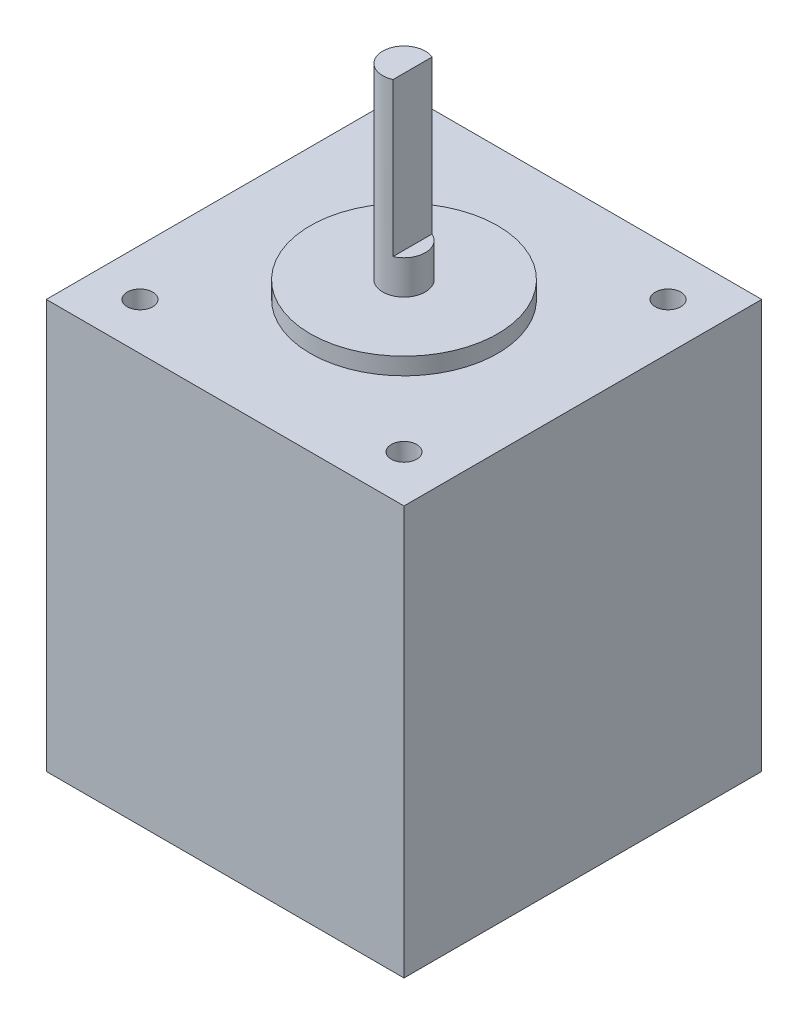
ISO-10303-21;
HEADER;
FILE_DESCRIPTION(('STEP AP214'),'2;1');
FILE_NAME('part.step','',(''),(''),'','','');
FILE_SCHEMA(('AUTOMOTIVE_DESIGN { 1 0 10303 214 1 1 1 1 }'));
ENDSEC;
DATA;
#1=APPLICATION_CONTEXT('core data for automotive mechanical design processes');
#2=APPLICATION_PROTOCOL_DEFINITION('international standard','automotive_design',2000,#1);
#3=PRODUCT_CONTEXT('',#1,'mechanical');
#4=PRODUCT('Part','Part','',(#3));
#5=PRODUCT_RELATED_PRODUCT_CATEGORY('part','',(#4));
#6=PRODUCT_DEFINITION_FORMATION('','',#4);
#7=PRODUCT_DEFINITION_CONTEXT('part definition',#1,'design');
#8=PRODUCT_DEFINITION('design','',#6,#7);
#9=PRODUCT_DEFINITION_SHAPE('','',#8);
#10=(LENGTH_UNIT() NAMED_UNIT(*) SI_UNIT(.MILLI.,.METRE.));
#11=(NAMED_UNIT(*) PLANE_ANGLE_UNIT() SI_UNIT($,.RADIAN.));
#12=(NAMED_UNIT(*) SI_UNIT($,.STERADIAN.) SOLID_ANGLE_UNIT());
#13=UNCERTAINTY_MEASURE_WITH_UNIT(LENGTH_MEASURE(1.E-05),#10,'distance_accuracy_value','');
#14=(GEOMETRIC_REPRESENTATION_CONTEXT(3) GLOBAL_UNCERTAINTY_ASSIGNED_CONTEXT((#13)) GLOBAL_UNIT_ASSIGNED_CONTEXT((#10,
#11,#12)) REPRESENTATION_CONTEXT('',''));
#15=CARTESIAN_POINT('',(0.,0.,0.));
#16=DIRECTION('',(0.,0.,1.));
#17=DIRECTION('',(1.,0.,0.));
#18=AXIS2_PLACEMENT_3D('',#15,#16,#17);
#19=CARTESIAN_POINT('',(21.,72.,-21.));
#20=DIRECTION('',(0.,-1.,0.));
#21=DIRECTION('',(0.,0.,-1.));
#22=AXIS2_PLACEMENT_3D('',#19,#20,#21);
#23=CYLINDRICAL_SURFACE('',#22,2.5);
#24=CARTESIAN_POINT('',(21.,50.,-21.));
#25=DIRECTION('',(0.,1.,0.));
#26=DIRECTION('',(0.,0.,1.));
#27=AXIS2_PLACEMENT_3D('',#24,#25,#26);
#28=CIRCLE('',#27,2.5);
#29=CARTESIAN_POINT('',(21.,50.,-18.5));
#30=VERTEX_POINT('',#29);
#31=EDGE_CURVE('E11',#30,#30,#28,.T.);
#32=ORIENTED_EDGE('',*,*,#31,.T.);
#33=EDGE_LOOP('',(#32));
#34=FACE_BOUND('',#33,.T.);
#35=DIRECTION('',(0.,1.,0.));
#36=VECTOR('',#35,1.);
#37=CARTESIAN_POINT('',(22.,54.,-18.7087121525221));
#38=LINE('',#37,#36);
#39=CARTESIAN_POINT('',(22.,54.,-18.7087121525221));
#40=VERTEX_POINT('',#39);
#41=CARTESIAN_POINT('',(22.,72.,-18.7087121525221));
#42=VERTEX_POINT('',#41);
#43=EDGE_CURVE('E105',#40,#42,#38,.T.);
#44=ORIENTED_EDGE('',*,*,#43,.T.);
#45=CARTESIAN_POINT('',(21.,72.,-21.));
#46=DIRECTION('',(0.,1.,0.));
#47=DIRECTION('',(0.,0.,1.));
#48=AXIS2_PLACEMENT_3D('',#45,#46,#47);
#49=CIRCLE('',#48,2.5);
#50=CARTESIAN_POINT('',(22.,72.,-23.2912878474779));
#51=VERTEX_POINT('',#50);
#52=EDGE_CURVE('E128',#51,#42,#49,.T.);
#53=ORIENTED_EDGE('',*,*,#52,.F.);
#54=DIRECTION('',(0.,1.,0.));
#55=VECTOR('',#54,1.);
#56=CARTESIAN_POINT('',(22.,54.,-23.2912878474779));
#57=LINE('',#56,#55);
#58=CARTESIAN_POINT('',(22.,54.,-23.2912878474779));
#59=VERTEX_POINT('',#58);
#60=EDGE_CURVE('E59',#59,#51,#57,.T.);
#61=ORIENTED_EDGE('',*,*,#60,.F.);
#62=CARTESIAN_POINT('',(21.,54.,-21.));
#63=DIRECTION('',(0.,1.,0.));
#64=DIRECTION('',(0.,0.,1.));
#65=AXIS2_PLACEMENT_3D('',#62,#63,#64);
#66=CIRCLE('',#65,2.5);
#67=EDGE_CURVE('E116',#40,#59,#66,.T.);
#68=ORIENTED_EDGE('',*,*,#67,.F.);
#69=EDGE_LOOP('',(#44,#53,#61,#68));
#70=FACE_BOUND('',#69,.T.);
#71=ADVANCED_FACE('F41',(#34,#70),#23,.T.);
#72=CARTESIAN_POINT('',(21.,72.,-21.));
#73=DIRECTION('',(0.,1.,0.));
#74=DIRECTION('',(0.,0.,1.));
#75=AXIS2_PLACEMENT_3D('',#72,#73,#74);
#76=PLANE('',#75);
#77=ORIENTED_EDGE('',*,*,#52,.T.);
#78=DIRECTION('',(0.,0.,-1.));
#79=VECTOR('',#78,1.);
#80=CARTESIAN_POINT('',(22.,72.,0.));
#81=LINE('',#80,#79);
#82=EDGE_CURVE('E110',#42,#51,#81,.T.);
#83=ORIENTED_EDGE('',*,*,#82,.T.);
#84=EDGE_LOOP('',(#77,#83));
#85=FACE_BOUND('',#84,.T.);
#86=ADVANCED_FACE('F230',(#85),#76,.T.);
#87=CARTESIAN_POINT('',(0.,48.,0.));
#88=DIRECTION('',(1.,0.,0.));
#89=DIRECTION('',(0.,0.,-1.));
#90=AXIS2_PLACEMENT_3D('',#87,#88,#89);
#91=PLANE('',#90);
#92=DIRECTION('',(0.,0.,1.));
#93=VECTOR('',#92,1.);
#94=CARTESIAN_POINT('',(0.,0.,0.));
#95=LINE('',#94,#93);
#96=CARTESIAN_POINT('',(0.,0.,-42.));
#97=VERTEX_POINT('',#96);
#98=CARTESIAN_POINT('',(0.,0.,0.));
#99=VERTEX_POINT('',#98);
#100=EDGE_CURVE('E168',#97,#99,#95,.T.);
#101=ORIENTED_EDGE('',*,*,#100,.T.);
#102=DIRECTION('',(0.,-1.,0.));
#103=VECTOR('',#102,1.);
#104=CARTESIAN_POINT('',(0.,48.,0.));
#105=LINE('',#104,#103);
#106=CARTESIAN_POINT('',(0.,48.,0.));
#107=VERTEX_POINT('',#106);
#108=EDGE_CURVE('E45',#107,#99,#105,.T.);
#109=ORIENTED_EDGE('',*,*,#108,.F.);
#110=DIRECTION('',(0.,0.,1.));
#111=VECTOR('',#110,1.);
#112=CARTESIAN_POINT('',(0.,48.,0.));
#113=LINE('',#112,#111);
#114=CARTESIAN_POINT('',(0.,48.,-42.));
#115=VERTEX_POINT('',#114);
#116=EDGE_CURVE('E172',#115,#107,#113,.T.);
#117=ORIENTED_EDGE('',*,*,#116,.F.);
#118=DIRECTION('',(0.,-1.,0.));
#119=VECTOR('',#118,1.);
#120=CARTESIAN_POINT('',(0.,48.,-42.));
#121=LINE('',#120,#119);
#122=EDGE_CURVE('E182',#115,#97,#121,.T.);
#123=ORIENTED_EDGE('',*,*,#122,.T.);
#124=EDGE_LOOP('',(#101,#109,#117,#123));
#125=FACE_BOUND('',#124,.T.);
#126=ADVANCED_FACE('F43',(#125),#91,.F.);
#127=CARTESIAN_POINT('',(0.,48.,0.));
#128=DIRECTION('',(0.,0.,-1.));
#129=DIRECTION('',(-1.,0.,0.));
#130=AXIS2_PLACEMENT_3D('',#127,#128,#129);
#131=PLANE('',#130);
#132=DIRECTION('',(1.,0.,0.));
#133=VECTOR('',#132,1.);
#134=CARTESIAN_POINT('',(0.,0.,0.));
#135=LINE('',#134,#133);
#136=CARTESIAN_POINT('',(42.,0.,0.));
#137=VERTEX_POINT('',#136);
#138=EDGE_CURVE('E186',#99,#137,#135,.T.);
#139=ORIENTED_EDGE('',*,*,#138,.T.);
#140=DIRECTION('',(0.,-1.,0.));
#141=VECTOR('',#140,1.);
#142=CARTESIAN_POINT('',(42.,48.,0.));
#143=LINE('',#142,#141);
#144=CARTESIAN_POINT('',(42.,48.,0.));
#145=VERTEX_POINT('',#144);
#146=EDGE_CURVE('E198',#145,#137,#143,.T.);
#147=ORIENTED_EDGE('',*,*,#146,.F.);
#148=DIRECTION('',(1.,0.,0.));
#149=VECTOR('',#148,1.);
#150=CARTESIAN_POINT('',(0.,48.,0.));
#151=LINE('',#150,#149);
#152=EDGE_CURVE('E97',#107,#145,#151,.T.);
#153=ORIENTED_EDGE('',*,*,#152,.F.);
#154=ORIENTED_EDGE('',*,*,#108,.T.);
#155=EDGE_LOOP('',(#139,#147,#153,#154));
#156=FACE_BOUND('',#155,.T.);
#157=ADVANCED_FACE('F206',(#156),#131,.F.);
#158=CARTESIAN_POINT('',(42.,48.,0.));
#159=DIRECTION('',(-1.,0.,0.));
#160=DIRECTION('',(0.,0.,1.));
#161=AXIS2_PLACEMENT_3D('',#158,#159,#160);
#162=PLANE('',#161);
#163=DIRECTION('',(0.,0.,-1.));
#164=VECTOR('',#163,1.);
#165=CARTESIAN_POINT('',(42.,0.,0.));
#166=LINE('',#165,#164);
#167=CARTESIAN_POINT('',(42.,0.,-42.));
#168=VERTEX_POINT('',#167);
#169=EDGE_CURVE('E189',#137,#168,#166,.T.);
#170=ORIENTED_EDGE('',*,*,#169,.T.);
#171=DIRECTION('',(0.,-1.,0.));
#172=VECTOR('',#171,1.);
#173=CARTESIAN_POINT('',(42.,48.,-42.));
#174=LINE('',#173,#172);
#175=CARTESIAN_POINT('',(42.,48.,-42.));
#176=VERTEX_POINT('',#175);
#177=EDGE_CURVE('E196',#176,#168,#174,.T.);
#178=ORIENTED_EDGE('',*,*,#177,.F.);
#179=DIRECTION('',(0.,0.,-1.));
#180=VECTOR('',#179,1.);
#181=CARTESIAN_POINT('',(42.,48.,0.));
#182=LINE('',#181,#180);
#183=EDGE_CURVE('E177',#145,#176,#182,.T.);
#184=ORIENTED_EDGE('',*,*,#183,.F.);
#185=ORIENTED_EDGE('',*,*,#146,.T.);
#186=EDGE_LOOP('',(#170,#178,#184,#185));
#187=FACE_BOUND('',#186,.T.);
#188=ADVANCED_FACE('F213',(#187),#162,.F.);
#189=CARTESIAN_POINT('',(0.,48.,-42.));
#190=DIRECTION('',(0.,0.,1.));
#191=DIRECTION('',(1.,0.,0.));
#192=AXIS2_PLACEMENT_3D('',#189,#190,#191);
#193=PLANE('',#192);
#194=DIRECTION('',(-1.,0.,0.));
#195=VECTOR('',#194,1.);
#196=CARTESIAN_POINT('',(0.,0.,-42.));
#197=LINE('',#196,#195);
#198=EDGE_CURVE('E89',#168,#97,#197,.T.);
#199=ORIENTED_EDGE('',*,*,#198,.T.);
#200=ORIENTED_EDGE('',*,*,#122,.F.);
#201=DIRECTION('',(-1.,0.,0.));
#202=VECTOR('',#201,1.);
#203=CARTESIAN_POINT('',(0.,48.,-42.));
#204=LINE('',#203,#202);
#205=EDGE_CURVE('E68',#176,#115,#204,.T.);
#206=ORIENTED_EDGE('',*,*,#205,.F.);
#207=ORIENTED_EDGE('',*,*,#177,.T.);
#208=EDGE_LOOP('',(#199,#200,#206,#207));
#209=FACE_BOUND('',#208,.T.);
#210=ADVANCED_FACE('F214',(#209),#193,.F.);
#211=CARTESIAN_POINT('',(0.,48.,0.));
#212=DIRECTION('',(0.,-1.,0.));
#213=DIRECTION('',(0.,0.,-1.));
#214=AXIS2_PLACEMENT_3D('',#211,#212,#213);
#215=PLANE('',#214);
#216=CARTESIAN_POINT('',(36.5,48.,-36.5));
#217=DIRECTION('',(0.,-1.,0.));
#218=DIRECTION('',(0.,0.,-1.));
#219=AXIS2_PLACEMENT_3D('',#216,#217,#218);
#220=CIRCLE('',#219,1.5);
#221=CARTESIAN_POINT('',(36.5,48.,-38.));
#222=VERTEX_POINT('',#221);
#223=EDGE_CURVE('E160',#222,#222,#220,.T.);
#224=ORIENTED_EDGE('',*,*,#223,.T.);
#225=EDGE_LOOP('',(#224));
#226=FACE_BOUND('',#225,.T.);
#227=CARTESIAN_POINT('',(36.5,48.,-5.50000000000001));
#228=DIRECTION('',(0.,-1.,0.));
#229=DIRECTION('',(0.,0.,-1.));
#230=AXIS2_PLACEMENT_3D('',#227,#228,#229);
#231=CIRCLE('',#230,1.5);
#232=CARTESIAN_POINT('',(36.5,48.,-7.00000000000001));
#233=VERTEX_POINT('',#232);
#234=EDGE_CURVE('E156',#233,#233,#231,.T.);
#235=ORIENTED_EDGE('',*,*,#234,.T.);
#236=EDGE_LOOP('',(#235));
#237=FACE_BOUND('',#236,.T.);
#238=CARTESIAN_POINT('',(5.50000000000001,48.,-5.50000000000001));
#239=DIRECTION('',(0.,-1.,0.));
#240=DIRECTION('',(0.,0.,-1.));
#241=AXIS2_PLACEMENT_3D('',#238,#239,#240);
#242=CIRCLE('',#241,1.5);
#243=CARTESIAN_POINT('',(5.50000000000001,48.,-7.00000000000001));
#244=VERTEX_POINT('',#243);
#245=EDGE_CURVE('E152',#244,#244,#242,.T.);
#246=ORIENTED_EDGE('',*,*,#245,.T.);
#247=EDGE_LOOP('',(#246));
#248=FACE_BOUND('',#247,.T.);
#249=CARTESIAN_POINT('',(5.50000000000001,48.,-36.5));
#250=DIRECTION('',(0.,-1.,0.));
#251=DIRECTION('',(0.,0.,-1.));
#252=AXIS2_PLACEMENT_3D('',#249,#250,#251);
#253=CIRCLE('',#252,1.5);
#254=CARTESIAN_POINT('',(5.50000000000001,48.,-38.));
#255=VERTEX_POINT('',#254);
#256=EDGE_CURVE('E148',#255,#255,#253,.T.);
#257=ORIENTED_EDGE('',*,*,#256,.T.);
#258=EDGE_LOOP('',(#257));
#259=FACE_BOUND('',#258,.T.);
#260=CARTESIAN_POINT('',(21.,48.,-21.));
#261=DIRECTION('',(0.,1.,0.));
#262=DIRECTION('',(0.,0.,1.));
#263=AXIS2_PLACEMENT_3D('',#260,#261,#262);
#264=CIRCLE('',#263,11.);
#265=CARTESIAN_POINT('',(21.,48.,-10.));
#266=VERTEX_POINT('',#265);
#267=EDGE_CURVE('E51',#266,#266,#264,.T.);
#268=ORIENTED_EDGE('',*,*,#267,.F.);
#269=EDGE_LOOP('',(#268));
#270=FACE_BOUND('',#269,.T.);
#271=ORIENTED_EDGE('',*,*,#116,.T.);
#272=ORIENTED_EDGE('',*,*,#152,.T.);
#273=ORIENTED_EDGE('',*,*,#183,.T.);
#274=ORIENTED_EDGE('',*,*,#205,.T.);
#275=EDGE_LOOP('',(#271,#272,#273,#274));
#276=FACE_BOUND('',#275,.T.);
#277=ADVANCED_FACE('F215',(#226,#237,#248,#259,#270,#276),#215,.F.);
#278=CARTESIAN_POINT('',(0.,0.,0.));
#279=DIRECTION('',(0.,-1.,0.));
#280=DIRECTION('',(0.,0.,-1.));
#281=AXIS2_PLACEMENT_3D('',#278,#279,#280);
#282=PLANE('',#281);
#283=CARTESIAN_POINT('',(36.5,0.,-36.5));
#284=DIRECTION('',(0.,-1.,0.));
#285=DIRECTION('',(0.,0.,-1.));
#286=AXIS2_PLACEMENT_3D('',#283,#284,#285);
#287=CIRCLE('',#286,1.5);
#288=CARTESIAN_POINT('',(36.5,0.,-38.));
#289=VERTEX_POINT('',#288);
#290=EDGE_CURVE('E131',#289,#289,#287,.T.);
#291=ORIENTED_EDGE('',*,*,#290,.F.);
#292=EDGE_LOOP('',(#291));
#293=FACE_BOUND('',#292,.T.);
#294=CARTESIAN_POINT('',(36.5,0.,-5.50000000000001));
#295=DIRECTION('',(0.,-1.,0.));
#296=DIRECTION('',(0.,0.,-1.));
#297=AXIS2_PLACEMENT_3D('',#294,#295,#296);
#298=CIRCLE('',#297,1.5);
#299=CARTESIAN_POINT('',(36.5,0.,-7.00000000000001));
#300=VERTEX_POINT('',#299);
#301=EDGE_CURVE('E138',#300,#300,#298,.T.);
#302=ORIENTED_EDGE('',*,*,#301,.F.);
#303=EDGE_LOOP('',(#302));
#304=FACE_BOUND('',#303,.T.);
#305=CARTESIAN_POINT('',(5.50000000000001,0.,-5.50000000000001));
#306=DIRECTION('',(0.,-1.,0.));
#307=DIRECTION('',(0.,0.,-1.));
#308=AXIS2_PLACEMENT_3D('',#305,#306,#307);
#309=CIRCLE('',#308,1.5);
#310=CARTESIAN_POINT('',(5.50000000000001,0.,-7.00000000000001));
#311=VERTEX_POINT('',#310);
#312=EDGE_CURVE('E133',#311,#311,#309,.T.);
#313=ORIENTED_EDGE('',*,*,#312,.F.);
#314=EDGE_LOOP('',(#313));
#315=FACE_BOUND('',#314,.T.);
#316=CARTESIAN_POINT('',(5.50000000000001,0.,-36.5));
#317=DIRECTION('',(0.,-1.,0.));
#318=DIRECTION('',(0.,0.,-1.));
#319=AXIS2_PLACEMENT_3D('',#316,#317,#318);
#320=CIRCLE('',#319,1.5);
#321=CARTESIAN_POINT('',(5.50000000000001,0.,-38.));
#322=VERTEX_POINT('',#321);
#323=EDGE_CURVE('E137',#322,#322,#320,.T.);
#324=ORIENTED_EDGE('',*,*,#323,.F.);
#325=EDGE_LOOP('',(#324));
#326=FACE_BOUND('',#325,.T.);
#327=ORIENTED_EDGE('',*,*,#100,.F.);
#328=ORIENTED_EDGE('',*,*,#198,.F.);
#329=ORIENTED_EDGE('',*,*,#169,.F.);
#330=ORIENTED_EDGE('',*,*,#138,.F.);
#331=EDGE_LOOP('',(#327,#328,#329,#330));
#332=FACE_BOUND('',#331,.T.);
#333=ADVANCED_FACE('F211',(#293,#304,#315,#326,#332),#282,.T.);
#334=CARTESIAN_POINT('',(21.,50.,-21.));
#335=DIRECTION('',(0.,-1.,0.));
#336=DIRECTION('',(0.,0.,-1.));
#337=AXIS2_PLACEMENT_3D('',#334,#335,#336);
#338=CYLINDRICAL_SURFACE('',#337,11.);
#339=CARTESIAN_POINT('',(21.,50.,-21.));
#340=DIRECTION('',(0.,1.,0.));
#341=DIRECTION('',(0.,0.,1.));
#342=AXIS2_PLACEMENT_3D('',#339,#340,#341);
#343=CIRCLE('',#342,11.);
#344=CARTESIAN_POINT('',(21.,50.,-10.));
#345=VERTEX_POINT('',#344);
#346=EDGE_CURVE('E164',#345,#345,#343,.T.);
#347=ORIENTED_EDGE('',*,*,#346,.F.);
#348=EDGE_LOOP('',(#347));
#349=FACE_BOUND('',#348,.T.);
#350=ORIENTED_EDGE('',*,*,#267,.T.);
#351=EDGE_LOOP('',(#350));
#352=FACE_BOUND('',#351,.T.);
#353=ADVANCED_FACE('F223',(#349,#352),#338,.T.);
#354=CARTESIAN_POINT('',(0.,50.,0.));
#355=DIRECTION('',(0.,1.,0.));
#356=DIRECTION('',(0.,0.,1.));
#357=AXIS2_PLACEMENT_3D('',#354,#355,#356);
#358=PLANE('',#357);
#359=ORIENTED_EDGE('',*,*,#31,.F.);
#360=EDGE_LOOP('',(#359));
#361=FACE_BOUND('',#360,.T.);
#362=ORIENTED_EDGE('',*,*,#346,.T.);
#363=EDGE_LOOP('',(#362));
#364=FACE_BOUND('',#363,.T.);
#365=ADVANCED_FACE('F255',(#361,#364),#358,.T.);
#366=CARTESIAN_POINT('',(5.50000000000001,50.,-36.5));
#367=DIRECTION('',(0.,-1.,0.));
#368=DIRECTION('',(0.,0.,-1.));
#369=AXIS2_PLACEMENT_3D('',#366,#367,#368);
#370=CYLINDRICAL_SURFACE('',#369,1.5);
#371=ORIENTED_EDGE('',*,*,#323,.T.);
#372=EDGE_LOOP('',(#371));
#373=FACE_BOUND('',#372,.T.);
#374=ORIENTED_EDGE('',*,*,#256,.F.);
#375=EDGE_LOOP('',(#374));
#376=FACE_BOUND('',#375,.T.);
#377=ADVANCED_FACE('F244',(#373,#376),#370,.F.);
#378=CARTESIAN_POINT('',(5.50000000000001,50.,-5.50000000000001));
#379=DIRECTION('',(0.,-1.,0.));
#380=DIRECTION('',(0.,0.,-1.));
#381=AXIS2_PLACEMENT_3D('',#378,#379,#380);
#382=CYLINDRICAL_SURFACE('',#381,1.5);
#383=ORIENTED_EDGE('',*,*,#312,.T.);
#384=EDGE_LOOP('',(#383));
#385=FACE_BOUND('',#384,.T.);
#386=ORIENTED_EDGE('',*,*,#245,.F.);
#387=EDGE_LOOP('',(#386));
#388=FACE_BOUND('',#387,.T.);
#389=ADVANCED_FACE('F240',(#385,#388),#382,.F.);
#390=CARTESIAN_POINT('',(36.5,50.,-5.50000000000001));
#391=DIRECTION('',(0.,-1.,0.));
#392=DIRECTION('',(0.,0.,-1.));
#393=AXIS2_PLACEMENT_3D('',#390,#391,#392);
#394=CYLINDRICAL_SURFACE('',#393,1.5);
#395=ORIENTED_EDGE('',*,*,#301,.T.);
#396=EDGE_LOOP('',(#395));
#397=FACE_BOUND('',#396,.T.);
#398=ORIENTED_EDGE('',*,*,#234,.F.);
#399=EDGE_LOOP('',(#398));
#400=FACE_BOUND('',#399,.T.);
#401=ADVANCED_FACE('F243',(#397,#400),#394,.F.);
#402=CARTESIAN_POINT('',(36.5,50.,-36.5));
#403=DIRECTION('',(0.,-1.,0.));
#404=DIRECTION('',(0.,0.,-1.));
#405=AXIS2_PLACEMENT_3D('',#402,#403,#404);
#406=CYLINDRICAL_SURFACE('',#405,1.5);
#407=ORIENTED_EDGE('',*,*,#290,.T.);
#408=EDGE_LOOP('',(#407));
#409=FACE_BOUND('',#408,.T.);
#410=ORIENTED_EDGE('',*,*,#223,.F.);
#411=EDGE_LOOP('',(#410));
#412=FACE_BOUND('',#411,.T.);
#413=ADVANCED_FACE('F248',(#409,#412),#406,.F.);
#414=CARTESIAN_POINT('',(22.,54.,0.));
#415=DIRECTION('',(1.,0.,0.));
#416=DIRECTION('',(0.,0.,-1.));
#417=AXIS2_PLACEMENT_3D('',#414,#415,#416);
#418=PLANE('',#417);
#419=ORIENTED_EDGE('',*,*,#82,.F.);
#420=ORIENTED_EDGE('',*,*,#43,.F.);
#421=DIRECTION('',(0.,0.,-1.));
#422=VECTOR('',#421,1.);
#423=CARTESIAN_POINT('',(22.,54.,0.));
#424=LINE('',#423,#422);
#425=EDGE_CURVE('E108',#40,#59,#424,.T.);
#426=ORIENTED_EDGE('',*,*,#425,.T.);
#427=ORIENTED_EDGE('',*,*,#60,.T.);
#428=EDGE_LOOP('',(#419,#420,#426,#427));
#429=FACE_BOUND('',#428,.T.);
#430=ADVANCED_FACE('F107',(#429),#418,.T.);
#431=CARTESIAN_POINT('',(0.,54.,0.));
#432=DIRECTION('',(0.,1.,0.));
#433=DIRECTION('',(0.,0.,1.));
#434=AXIS2_PLACEMENT_3D('',#431,#432,#433);
#435=PLANE('',#434);
#436=ORIENTED_EDGE('',*,*,#425,.F.);
#437=ORIENTED_EDGE('',*,*,#67,.T.);
#438=EDGE_LOOP('',(#436,#437));
#439=FACE_BOUND('',#438,.T.);
#440=ADVANCED_FACE('F119',(#439),#435,.T.);
#441=CLOSED_SHELL('',(#71,#86,#126,#157,#188,#210,#277,#333,#353,#365,#377,#389,#401,#413,#430,#440));
#442=MANIFOLD_SOLID_BREP('B2',#441);
#443=ADVANCED_BREP_SHAPE_REPRESENTATION('',(#18,#442),#14);
#444=SHAPE_DEFINITION_REPRESENTATION(#9,#443);
ENDSEC;
END-ISO-10303-21;
